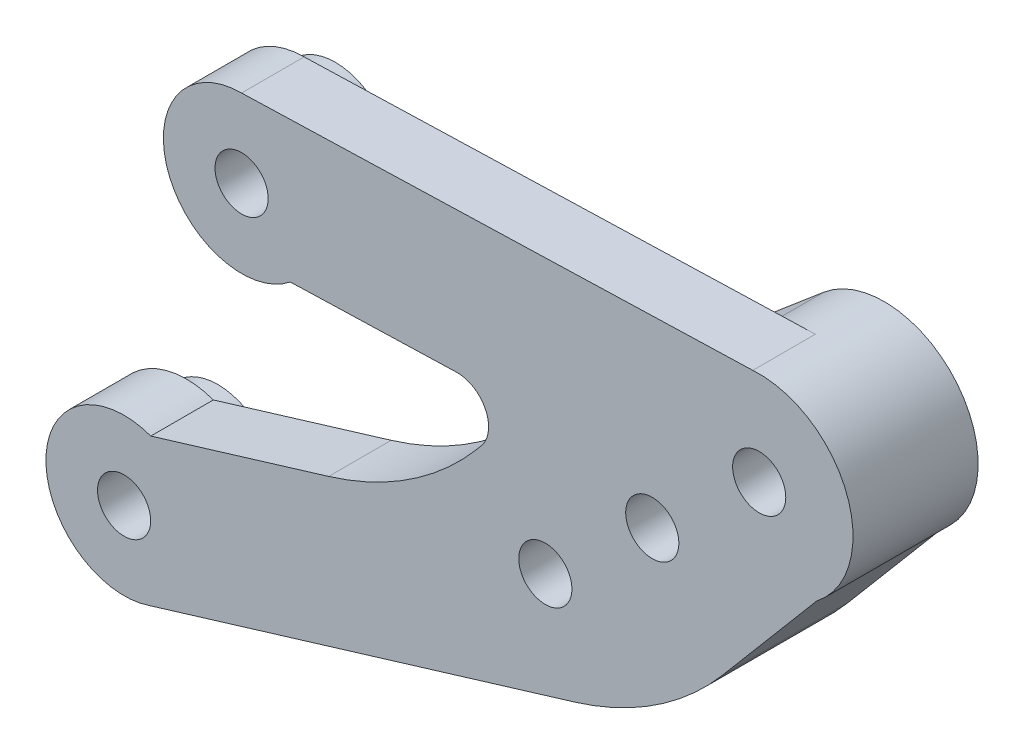
ISO-10303-21;
HEADER;
FILE_DESCRIPTION(('STEP AP214'),'2;1');
FILE_NAME('part.step','',(''),(''),'','','');
FILE_SCHEMA(('AUTOMOTIVE_DESIGN { 1 0 10303 214 1 1 1 1 }'));
ENDSEC;
DATA;
#1=APPLICATION_CONTEXT('core data for automotive mechanical design processes');
#2=APPLICATION_PROTOCOL_DEFINITION('international standard','automotive_design',2000,#1);
#3=PRODUCT_CONTEXT('',#1,'mechanical');
#4=PRODUCT('Part','Part','',(#3));
#5=PRODUCT_RELATED_PRODUCT_CATEGORY('part','',(#4));
#6=PRODUCT_DEFINITION_FORMATION('','',#4);
#7=PRODUCT_DEFINITION_CONTEXT('part definition',#1,'design');
#8=PRODUCT_DEFINITION('design','',#6,#7);
#9=PRODUCT_DEFINITION_SHAPE('','',#8);
#10=(LENGTH_UNIT() NAMED_UNIT(*) SI_UNIT(.MILLI.,.METRE.));
#11=(NAMED_UNIT(*) PLANE_ANGLE_UNIT() SI_UNIT($,.RADIAN.));
#12=(NAMED_UNIT(*) SI_UNIT($,.STERADIAN.) SOLID_ANGLE_UNIT());
#13=UNCERTAINTY_MEASURE_WITH_UNIT(LENGTH_MEASURE(1.E-05),#10,'distance_accuracy_value','');
#14=(GEOMETRIC_REPRESENTATION_CONTEXT(3) GLOBAL_UNCERTAINTY_ASSIGNED_CONTEXT((#13)) GLOBAL_UNIT_ASSIGNED_CONTEXT((#10,
#11,#12)) REPRESENTATION_CONTEXT('',''));
#15=CARTESIAN_POINT('',(0.,0.,0.));
#16=DIRECTION('',(0.,0.,1.));
#17=DIRECTION('',(1.,0.,0.));
#18=AXIS2_PLACEMENT_3D('',#15,#16,#17);
#19=CARTESIAN_POINT('',(0.,0.,-2.));
#20=DIRECTION('',(0.,0.,1.));
#21=DIRECTION('',(1.,0.,0.));
#22=AXIS2_PLACEMENT_3D('',#19,#20,#21);
#23=PLANE('',#22);
#24=CARTESIAN_POINT('',(26.9360632309097,9.68603359319531,-2.));
#25=DIRECTION('',(0.,0.,-1.));
#26=DIRECTION('',(-1.,0.,0.));
#27=AXIS2_PLACEMENT_3D('',#24,#25,#26);
#28=CIRCLE('',#27,6.44539896497374);
#29=CARTESIAN_POINT('',(28.8076552815149,3.5183508019198,-2.));
#30=VERTEX_POINT('',#29);
#31=CARTESIAN_POINT('',(21.6839891931415,13.4221928670333,-2.));
#32=VERTEX_POINT('',#31);
#33=EDGE_CURVE('E179',#30,#32,#28,.T.);
#34=ORIENTED_EDGE('',*,*,#33,.F.);
#35=DIRECTION('',(0.956912492894943,0.290376446947038,0.));
#36=VECTOR('',#35,1.);
#37=CARTESIAN_POINT('',(1.45139171596717,-4.78294599887616,-2.));
#38=LINE('',#37,#36);
#39=CARTESIAN_POINT('',(1.57575227360064,-4.74520861208887,-2.));
#40=VERTEX_POINT('',#39);
#41=EDGE_CURVE('E273',#40,#30,#38,.T.);
#42=ORIENTED_EDGE('',*,*,#41,.F.);
#43=CARTESIAN_POINT('',(0.,0.,-2.));
#44=DIRECTION('',(0.,0.,1.));
#45=DIRECTION('',(1.,0.,0.));
#46=AXIS2_PLACEMENT_3D('',#43,#44,#45);
#47=CIRCLE('',#46,5.);
#48=CARTESIAN_POINT('',(1.70658461953951,4.69974136909162,-2.));
#49=VERTEX_POINT('',#48);
#50=EDGE_CURVE('E269',#49,#40,#47,.T.);
#51=ORIENTED_EDGE('',*,*,#50,.F.);
#52=DIRECTION('',(-0.956912492894943,-0.290376446947038,0.));
#53=VECTOR('',#52,1.);
#54=CARTESIAN_POINT('',(-1.16199630655618,3.82926643717832,-2.));
#55=LINE('',#54,#53);
#56=CARTESIAN_POINT('',(13.0793967045248,8.15083725252361,-2.));
#57=VERTEX_POINT('',#56);
#58=EDGE_CURVE('E266',#57,#49,#55,.T.);
#59=ORIENTED_EDGE('',*,*,#58,.F.);
#60=CARTESIAN_POINT('',(7.27186776558407,27.2890871104225,-2.));
#61=DIRECTION('',(0.,0.,1.));
#62=DIRECTION('',(1.,0.,0.));
#63=AXIS2_PLACEMENT_3D('',#60,#61,#62);
#64=CIRCLE('',#63,20.);
#65=EDGE_CURVE('E311',#57,#32,#64,.T.);
#66=ORIENTED_EDGE('',*,*,#65,.T.);
#67=EDGE_LOOP('',(#34,#42,#51,#59,#66));
#68=FACE_BOUND('',#67,.T.);
#69=CARTESIAN_POINT('',(0.,0.,-2.));
#70=DIRECTION('',(0.,0.,1.));
#71=DIRECTION('',(1.,0.,0.));
#72=AXIS2_PLACEMENT_3D('',#69,#70,#71);
#73=CIRCLE('',#72,3.7);
#74=CARTESIAN_POINT('',(3.7,0.,-2.));
#75=VERTEX_POINT('',#74);
#76=EDGE_CURVE('E318',#75,#75,#73,.F.);
#77=ORIENTED_EDGE('',*,*,#76,.F.);
#78=EDGE_LOOP('',(#77));
#79=FACE_BOUND('',#78,.T.);
#80=ADVANCED_FACE('F41',(#68,#79),#23,.F.);
#81=CARTESIAN_POINT('',(40.6128867069486,21.6007739057783,-2.));
#82=DIRECTION('',(0.,0.,-1.));
#83=DIRECTION('',(-1.,0.,0.));
#84=AXIS2_PLACEMENT_3D('',#81,#82,#83);
#85=CIRCLE('',#84,6.);
#86=CARTESIAN_POINT('',(36.7334177781984,26.1778604060383,-2.));
#87=VERTEX_POINT('',#86);
#88=CARTESIAN_POINT('',(40.203783053973,27.5868105078317,-2.));
#89=VERTEX_POINT('',#88);
#90=EDGE_CURVE('E193',#87,#89,#85,.T.);
#91=ORIENTED_EDGE('',*,*,#90,.F.);
#92=DIRECTION('',(0.762847733091093,0.646578174792329,0.));
#93=VECTOR('',#92,1.);
#94=CARTESIAN_POINT('',(36.7334177781984,26.1778604060383,-2.));
#95=LINE('',#94,#93);
#96=EDGE_CURVE('E175',#32,#87,#95,.T.);
#97=ORIENTED_EDGE('',*,*,#96,.F.);
#98=CARTESIAN_POINT('',(22.5414357724455,14.3724198590053,-2.));
#99=VERTEX_POINT('',#98);
#100=EDGE_CURVE('E310',#32,#99,#64,.T.);
#101=ORIENTED_EDGE('',*,*,#100,.T.);
#102=DIRECTION('',(-0.645833362570859,-0.763478400343073,0.));
#103=VECTOR('',#102,1.);
#104=CARTESIAN_POINT('',(6.0526361731001,-5.11998030374497,-2.));
#105=LINE('',#104,#103);
#106=CARTESIAN_POINT('',(22.8356424846143,14.7202192806435,-2.));
#107=VERTEX_POINT('',#106);
#108=EDGE_CURVE('E263',#107,#99,#105,.T.);
#109=ORIENTED_EDGE('',*,*,#108,.F.);
#110=CARTESIAN_POINT('',(21.3086856839282,16.0118860057853,-2.));
#111=DIRECTION('',(0.,0.,1.));
#112=DIRECTION('',(1.,0.,0.));
#113=AXIS2_PLACEMENT_3D('',#110,#111,#112);
#114=CIRCLE('',#113,2.);
#115=CARTESIAN_POINT('',(21.248388262694,18.0109768543943,-2.));
#116=VERTEX_POINT('',#115);
#117=EDGE_CURVE('E11',#107,#116,#114,.T.);
#118=ORIENTED_EDGE('',*,*,#117,.T.);
#119=DIRECTION('',(0.999545424304533,0.0301487106170736,0.));
#120=VECTOR('',#119,1.);
#121=CARTESIAN_POINT('',(-0.523447280000722,17.3542855691174,-2.));
#122=LINE('',#121,#120);
#123=CARTESIAN_POINT('',(10.6291548266564,17.6906750571438,-2.));
#124=VERTEX_POINT('',#123);
#125=EDGE_CURVE('E259',#124,#116,#122,.T.);
#126=ORIENTED_EDGE('',*,*,#125,.F.);
#127=CARTESIAN_POINT('',(7.51288670694863,21.6007739057783,-2.));
#128=DIRECTION('',(0.,0.,1.));
#129=DIRECTION('',(1.,0.,0.));
#130=AXIS2_PLACEMENT_3D('',#127,#128,#129);
#131=CIRCLE('',#130,5.);
#132=CARTESIAN_POINT('',(7.51288670694863,26.6007739057783,-2.));
#133=VERTEX_POINT('',#132);
#134=EDGE_CURVE('E255',#133,#124,#131,.T.);
#135=ORIENTED_EDGE('',*,*,#134,.F.);
#136=DIRECTION('',(0.999545424304533,0.0301487106170735,0.));
#137=VECTOR('',#136,1.);
#138=CARTESIAN_POINT('',(-0.794785675554382,26.3501943878582,-2.));
#139=LINE('',#138,#137);
#140=EDGE_CURVE('E252',#133,#89,#139,.T.);
#141=ORIENTED_EDGE('',*,*,#140,.T.);
#142=EDGE_LOOP('',(#91,#97,#101,#109,#118,#126,#135,#141));
#143=FACE_BOUND('',#142,.T.);
#144=CARTESIAN_POINT('',(7.51288670694863,21.6007739057783,-2.));
#145=DIRECTION('',(0.,0.,1.));
#146=DIRECTION('',(1.,0.,0.));
#147=AXIS2_PLACEMENT_3D('',#144,#145,#146);
#148=CIRCLE('',#147,3.7);
#149=CARTESIAN_POINT('',(11.2128867069486,21.6007739057783,-2.));
#150=VERTEX_POINT('',#149);
#151=EDGE_CURVE('E314',#150,#150,#148,.F.);
#152=ORIENTED_EDGE('',*,*,#151,.F.);
#153=EDGE_LOOP('',(#152));
#154=FACE_BOUND('',#153,.T.);
#155=ADVANCED_FACE('F334',(#143,#154),#23,.F.);
#156=CARTESIAN_POINT('',(-0.794785675554382,26.3501943878582,-2.));
#157=DIRECTION('',(0.0301487106170735,-0.999545424304533,0.));
#158=DIRECTION('',(0.999545424304533,0.0301487106170735,0.));
#159=AXIS2_PLACEMENT_3D('',#156,#157,#158);
#160=PLANE('',#159);
#161=DIRECTION('',(0.,0.,1.));
#162=VECTOR('',#161,1.);
#163=CARTESIAN_POINT('',(7.51288670694863,26.6007739057783,-2.));
#164=LINE('',#163,#162);
#165=CARTESIAN_POINT('',(7.51288670694863,26.6007739057783,2.));
#166=VERTEX_POINT('',#165);
#167=EDGE_CURVE('E277',#133,#166,#164,.T.);
#168=ORIENTED_EDGE('',*,*,#167,.T.);
#169=DIRECTION('',(0.999545424304533,0.0301487106170735,0.));
#170=VECTOR('',#169,1.);
#171=CARTESIAN_POINT('',(-0.794785675554382,26.3501943878582,2.));
#172=LINE('',#171,#170);
#173=CARTESIAN_POINT('',(40.203783053973,27.5868105078317,2.));
#174=VERTEX_POINT('',#173);
#175=EDGE_CURVE('E222',#166,#174,#172,.T.);
#176=ORIENTED_EDGE('',*,*,#175,.T.);
#177=DIRECTION('',(0.,0.,1.));
#178=VECTOR('',#177,1.);
#179=CARTESIAN_POINT('',(40.203783053973,27.5868105078317,-2.));
#180=LINE('',#179,#178);
#181=EDGE_CURVE('E156',#89,#174,#180,.T.);
#182=ORIENTED_EDGE('',*,*,#181,.F.);
#183=ORIENTED_EDGE('',*,*,#140,.F.);
#184=EDGE_LOOP('',(#168,#176,#182,#183));
#185=FACE_BOUND('',#184,.T.);
#186=ADVANCED_FACE('F357',(#185),#160,.F.);
#187=CARTESIAN_POINT('',(40.6128867069486,21.6007739057783,-2.));
#188=DIRECTION('',(0.,0.,1.));
#189=DIRECTION('',(1.,0.,0.));
#190=AXIS2_PLACEMENT_3D('',#187,#188,#189);
#191=CYLINDRICAL_SURFACE('',#190,6.);
#192=ORIENTED_EDGE('',*,*,#181,.T.);
#193=CARTESIAN_POINT('',(40.6128867069486,21.6007739057783,2.));
#194=DIRECTION('',(0.,0.,1.));
#195=DIRECTION('',(1.,0.,0.));
#196=AXIS2_PLACEMENT_3D('',#193,#194,#195);
#197=CIRCLE('',#196,6.);
#198=CARTESIAN_POINT('',(44.2966352413055,16.8647421559245,2.));
#199=VERTEX_POINT('',#198);
#200=EDGE_CURVE('E152',#199,#174,#197,.T.);
#201=ORIENTED_EDGE('',*,*,#200,.F.);
#202=DIRECTION('',(0.,0.,1.));
#203=VECTOR('',#202,1.);
#204=CARTESIAN_POINT('',(44.2966352413055,16.8647421559245,-2.));
#205=LINE('',#204,#203);
#206=CARTESIAN_POINT('',(44.2966352413055,16.8647421559245,-6.));
#207=VERTEX_POINT('',#206);
#208=EDGE_CURVE('E145',#207,#199,#205,.T.);
#209=ORIENTED_EDGE('',*,*,#208,.F.);
#210=CARTESIAN_POINT('',(40.6128867069486,21.6007739057783,-6.));
#211=DIRECTION('',(0.,0.,-1.));
#212=DIRECTION('',(-1.,0.,0.));
#213=AXIS2_PLACEMENT_3D('',#210,#211,#212);
#214=CIRCLE('',#213,6.);
#215=CARTESIAN_POINT('',(36.7334177781984,26.1778604060383,-6.));
#216=VERTEX_POINT('',#215);
#217=EDGE_CURVE('E150',#216,#207,#214,.T.);
#218=ORIENTED_EDGE('',*,*,#217,.F.);
#219=DIRECTION('',(0.,0.,1.));
#220=VECTOR('',#219,1.);
#221=CARTESIAN_POINT('',(36.7334177781984,26.1778604060383,-6.));
#222=LINE('',#221,#220);
#223=EDGE_CURVE('E192',#216,#87,#222,.T.);
#224=ORIENTED_EDGE('',*,*,#223,.T.);
#225=ORIENTED_EDGE('',*,*,#90,.T.);
#226=EDGE_LOOP('',(#192,#201,#209,#218,#224,#225));
#227=FACE_BOUND('',#226,.T.);
#228=ADVANCED_FACE('F147',(#227),#191,.T.);
#229=CARTESIAN_POINT('',(17.5048121782462,-14.8074807423079,-2.));
#230=DIRECTION('',(0.763478400343073,-0.645833362570859,0.));
#231=DIRECTION('',(0.645833362570859,0.763478400343073,0.));
#232=AXIS2_PLACEMENT_3D('',#229,#230,#231);
#233=PLANE('',#232);
#234=DIRECTION('',(0.645833362570859,0.763478400343073,0.));
#235=VECTOR('',#234,1.);
#236=CARTESIAN_POINT('',(17.5048121782462,-14.8074807423079,2.));
#237=LINE('',#236,#235);
#238=CARTESIAN_POINT('',(38.2696943494356,9.7399334084015,2.));
#239=VERTEX_POINT('',#238);
#240=EDGE_CURVE('E247',#239,#199,#237,.T.);
#241=ORIENTED_EDGE('',*,*,#240,.F.);
#242=DIRECTION('',(0.,0.,1.));
#243=VECTOR('',#242,1.);
#244=CARTESIAN_POINT('',(38.2696943494356,9.73993340840149,-2.));
#245=LINE('',#244,#243);
#246=CARTESIAN_POINT('',(38.2696943494356,9.7399334084015,-6.));
#247=VERTEX_POINT('',#246);
#248=EDGE_CURVE('E163',#239,#247,#245,.F.);
#249=ORIENTED_EDGE('',*,*,#248,.T.);
#250=DIRECTION('',(-0.645833362570859,-0.763478400343073,0.));
#251=VECTOR('',#250,1.);
#252=CARTESIAN_POINT('',(44.2966352413055,16.8647421559245,-6.));
#253=LINE('',#252,#251);
#254=EDGE_CURVE('E160',#207,#247,#253,.T.);
#255=ORIENTED_EDGE('',*,*,#254,.F.);
#256=ORIENTED_EDGE('',*,*,#208,.T.);
#257=EDGE_LOOP('',(#241,#249,#255,#256));
#258=FACE_BOUND('',#257,.T.);
#259=ADVANCED_FACE('F161',(#258),#233,.T.);
#260=CARTESIAN_POINT('',(1.45139171596717,-4.78294599887616,-2.));
#261=DIRECTION('',(0.290376446947038,-0.956912492894943,0.));
#262=DIRECTION('',(0.956912492894943,0.290376446947038,0.));
#263=AXIS2_PLACEMENT_3D('',#260,#261,#262);
#264=PLANE('',#263);
#265=ORIENTED_EDGE('',*,*,#41,.T.);
#266=DIRECTION('',(0.,0.,1.));
#267=VECTOR('',#266,1.);
#268=CARTESIAN_POINT('',(28.8076552815149,3.5183508019198,-2.));
#269=LINE('',#268,#267);
#270=CARTESIAN_POINT('',(28.8076552815149,3.5183508019198,2.));
#271=VERTEX_POINT('',#270);
#272=EDGE_CURVE('E298',#30,#271,#269,.T.);
#273=ORIENTED_EDGE('',*,*,#272,.T.);
#274=DIRECTION('',(0.956912492894943,0.290376446947038,0.));
#275=VECTOR('',#274,1.);
#276=CARTESIAN_POINT('',(1.45139171596717,-4.78294599887616,2.));
#277=LINE('',#276,#275);
#278=CARTESIAN_POINT('',(1.57575227360064,-4.74520861208887,2.));
#279=VERTEX_POINT('',#278);
#280=EDGE_CURVE('E243',#279,#271,#277,.T.);
#281=ORIENTED_EDGE('',*,*,#280,.F.);
#282=DIRECTION('',(0.,0.,1.));
#283=VECTOR('',#282,1.);
#284=CARTESIAN_POINT('',(1.57575227360064,-4.74520861208887,-2.));
#285=LINE('',#284,#283);
#286=EDGE_CURVE('E157',#40,#279,#285,.T.);
#287=ORIENTED_EDGE('',*,*,#286,.F.);
#288=EDGE_LOOP('',(#265,#273,#281,#287));
#289=FACE_BOUND('',#288,.T.);
#290=ADVANCED_FACE('F372',(#289),#264,.T.);
#291=CARTESIAN_POINT('',(0.,0.,-2.));
#292=DIRECTION('',(0.,0.,1.));
#293=DIRECTION('',(1.,0.,0.));
#294=AXIS2_PLACEMENT_3D('',#291,#292,#293);
#295=CYLINDRICAL_SURFACE('',#294,5.);
#296=ORIENTED_EDGE('',*,*,#286,.T.);
#297=CARTESIAN_POINT('',(0.,0.,2.));
#298=DIRECTION('',(0.,0.,1.));
#299=DIRECTION('',(1.,0.,0.));
#300=AXIS2_PLACEMENT_3D('',#297,#298,#299);
#301=CIRCLE('',#300,5.);
#302=CARTESIAN_POINT('',(1.70658461953951,4.69974136909162,2.));
#303=VERTEX_POINT('',#302);
#304=EDGE_CURVE('E239',#303,#279,#301,.T.);
#305=ORIENTED_EDGE('',*,*,#304,.F.);
#306=DIRECTION('',(0.,0.,1.));
#307=VECTOR('',#306,1.);
#308=CARTESIAN_POINT('',(1.70658461953951,4.69974136909162,-2.));
#309=LINE('',#308,#307);
#310=EDGE_CURVE('E283',#49,#303,#309,.T.);
#311=ORIENTED_EDGE('',*,*,#310,.F.);
#312=ORIENTED_EDGE('',*,*,#50,.T.);
#313=EDGE_LOOP('',(#296,#305,#311,#312));
#314=FACE_BOUND('',#313,.T.);
#315=ADVANCED_FACE('F381',(#314),#295,.T.);
#316=CARTESIAN_POINT('',(-1.16199630655618,3.82926643717832,-2.));
#317=DIRECTION('',(-0.290376446947038,0.956912492894943,0.));
#318=DIRECTION('',(-0.956912492894943,-0.290376446947038,0.));
#319=AXIS2_PLACEMENT_3D('',#316,#317,#318);
#320=PLANE('',#319);
#321=DIRECTION('',(-0.956912492894943,-0.290376446947038,0.));
#322=VECTOR('',#321,1.);
#323=CARTESIAN_POINT('',(-1.16199630655618,3.82926643717832,2.));
#324=LINE('',#323,#322);
#325=CARTESIAN_POINT('',(13.0793967045248,8.15083725252361,2.));
#326=VERTEX_POINT('',#325);
#327=EDGE_CURVE('E236',#326,#303,#324,.T.);
#328=ORIENTED_EDGE('',*,*,#327,.F.);
#329=DIRECTION('',(0.,0.,1.));
#330=VECTOR('',#329,1.);
#331=CARTESIAN_POINT('',(13.0793967045248,8.15083725252361,-2.));
#332=LINE('',#331,#330);
#333=EDGE_CURVE('E295',#326,#57,#332,.F.);
#334=ORIENTED_EDGE('',*,*,#333,.T.);
#335=ORIENTED_EDGE('',*,*,#58,.T.);
#336=ORIENTED_EDGE('',*,*,#310,.T.);
#337=EDGE_LOOP('',(#328,#334,#335,#336));
#338=FACE_BOUND('',#337,.T.);
#339=ADVANCED_FACE('F383',(#338),#320,.T.);
#340=CARTESIAN_POINT('',(6.0526361731001,-5.11998030374497,-2.));
#341=DIRECTION('',(-0.763478400343073,0.645833362570859,0.));
#342=DIRECTION('',(-0.645833362570859,-0.763478400343073,0.));
#343=AXIS2_PLACEMENT_3D('',#340,#341,#342);
#344=PLANE('',#343);
#345=DIRECTION('',(-0.645833362570859,-0.763478400343073,0.));
#346=VECTOR('',#345,1.);
#347=CARTESIAN_POINT('',(6.0526361731001,-5.11998030374497,2.));
#348=LINE('',#347,#346);
#349=CARTESIAN_POINT('',(22.8356424846143,14.7202192806435,2.));
#350=VERTEX_POINT('',#349);
#351=CARTESIAN_POINT('',(22.5414357724455,14.3724198590053,2.));
#352=VERTEX_POINT('',#351);
#353=EDGE_CURVE('E233',#350,#352,#348,.T.);
#354=ORIENTED_EDGE('',*,*,#353,.F.);
#355=DIRECTION('',(0.,0.,1.));
#356=VECTOR('',#355,1.);
#357=CARTESIAN_POINT('',(22.8356424846143,14.7202192806435,-2.));
#358=LINE('',#357,#356);
#359=EDGE_CURVE('E63',#350,#107,#358,.F.);
#360=ORIENTED_EDGE('',*,*,#359,.T.);
#361=ORIENTED_EDGE('',*,*,#108,.T.);
#362=DIRECTION('',(0.,0.,1.));
#363=VECTOR('',#362,1.);
#364=CARTESIAN_POINT('',(22.5414357724455,14.3724198590053,2.));
#365=LINE('',#364,#363);
#366=EDGE_CURVE('E279',#99,#352,#365,.T.);
#367=ORIENTED_EDGE('',*,*,#366,.T.);
#368=EDGE_LOOP('',(#354,#360,#361,#367));
#369=FACE_BOUND('',#368,.T.);
#370=ADVANCED_FACE('F342',(#369),#344,.T.);
#371=CARTESIAN_POINT('',(-0.523447280000722,17.3542855691174,-2.));
#372=DIRECTION('',(0.0301487106170736,-0.999545424304533,0.));
#373=DIRECTION('',(0.999545424304533,0.0301487106170736,0.));
#374=AXIS2_PLACEMENT_3D('',#371,#372,#373);
#375=PLANE('',#374);
#376=ORIENTED_EDGE('',*,*,#125,.T.);
#377=DIRECTION('',(0.,0.,1.));
#378=VECTOR('',#377,1.);
#379=CARTESIAN_POINT('',(21.248388262694,18.0109768543943,2.));
#380=LINE('',#379,#378);
#381=CARTESIAN_POINT('',(21.248388262694,18.0109768543943,2.));
#382=VERTEX_POINT('',#381);
#383=EDGE_CURVE('E322',#116,#382,#380,.T.);
#384=ORIENTED_EDGE('',*,*,#383,.T.);
#385=DIRECTION('',(0.999545424304533,0.0301487106170736,0.));
#386=VECTOR('',#385,1.);
#387=CARTESIAN_POINT('',(-0.523447280000722,17.3542855691174,2.));
#388=LINE('',#387,#386);
#389=CARTESIAN_POINT('',(10.6291548266564,17.6906750571438,2.));
#390=VERTEX_POINT('',#389);
#391=EDGE_CURVE('E230',#390,#382,#388,.T.);
#392=ORIENTED_EDGE('',*,*,#391,.F.);
#393=DIRECTION('',(0.,0.,1.));
#394=VECTOR('',#393,1.);
#395=CARTESIAN_POINT('',(10.6291548266564,17.6906750571438,-2.));
#396=LINE('',#395,#394);
#397=EDGE_CURVE('E287',#124,#390,#396,.T.);
#398=ORIENTED_EDGE('',*,*,#397,.F.);
#399=EDGE_LOOP('',(#376,#384,#392,#398));
#400=FACE_BOUND('',#399,.T.);
#401=ADVANCED_FACE('F348',(#400),#375,.T.);
#402=CARTESIAN_POINT('',(7.51288670694863,21.6007739057783,-2.));
#403=DIRECTION('',(0.,0.,1.));
#404=DIRECTION('',(1.,0.,0.));
#405=AXIS2_PLACEMENT_3D('',#402,#403,#404);
#406=CYLINDRICAL_SURFACE('',#405,1.7);
#407=CARTESIAN_POINT('',(7.51288670694863,21.6007739057783,2.));
#408=DIRECTION('',(0.,0.,1.));
#409=DIRECTION('',(1.,0.,0.));
#410=AXIS2_PLACEMENT_3D('',#407,#408,#409);
#411=CIRCLE('',#410,1.7);
#412=CARTESIAN_POINT('',(9.21288670694863,21.6007739057783,2.));
#413=VERTEX_POINT('',#412);
#414=EDGE_CURVE('E218',#413,#413,#411,.T.);
#415=ORIENTED_EDGE('',*,*,#414,.T.);
#416=EDGE_LOOP('',(#415));
#417=FACE_BOUND('',#416,.T.);
#418=CARTESIAN_POINT('',(7.51288670694863,21.6007739057783,-4.));
#419=DIRECTION('',(0.,0.,-1.));
#420=DIRECTION('',(-1.,0.,0.));
#421=AXIS2_PLACEMENT_3D('',#418,#419,#420);
#422=CIRCLE('',#421,1.7);
#423=CARTESIAN_POINT('',(5.81288670694863,21.6007739057783,-4.));
#424=VERTEX_POINT('',#423);
#425=EDGE_CURVE('E633',#424,#424,#422,.T.);
#426=ORIENTED_EDGE('',*,*,#425,.T.);
#427=EDGE_LOOP('',(#426));
#428=FACE_BOUND('',#427,.T.);
#429=ADVANCED_FACE('F466',(#417,#428),#406,.F.);
#430=CARTESIAN_POINT('',(40.6128867069486,21.6007739057783,-2.));
#431=DIRECTION('',(0.,0.,1.));
#432=DIRECTION('',(1.,0.,0.));
#433=AXIS2_PLACEMENT_3D('',#430,#431,#432);
#434=CYLINDRICAL_SURFACE('',#433,1.7);
#435=CARTESIAN_POINT('',(40.6128867069486,21.6007739057783,2.));
#436=DIRECTION('',(0.,0.,1.));
#437=DIRECTION('',(1.,0.,0.));
#438=AXIS2_PLACEMENT_3D('',#435,#436,#437);
#439=CIRCLE('',#438,1.7);
#440=CARTESIAN_POINT('',(42.3128867069486,21.6007739057783,2.));
#441=VERTEX_POINT('',#440);
#442=EDGE_CURVE('E214',#441,#441,#439,.T.);
#443=ORIENTED_EDGE('',*,*,#442,.T.);
#444=EDGE_LOOP('',(#443));
#445=FACE_BOUND('',#444,.T.);
#446=CARTESIAN_POINT('',(40.6128867069486,21.6007739057783,-6.));
#447=DIRECTION('',(0.,0.,-1.));
#448=DIRECTION('',(-1.,0.,0.));
#449=AXIS2_PLACEMENT_3D('',#446,#447,#448);
#450=CIRCLE('',#449,1.7);
#451=CARTESIAN_POINT('',(38.9128867069486,21.6007739057783,-6.));
#452=VERTEX_POINT('',#451);
#453=EDGE_CURVE('E182',#452,#452,#450,.T.);
#454=ORIENTED_EDGE('',*,*,#453,.T.);
#455=EDGE_LOOP('',(#454));
#456=FACE_BOUND('',#455,.T.);
#457=ADVANCED_FACE('F460',(#445,#456),#434,.F.);
#458=CARTESIAN_POINT('',(0.,0.,-2.));
#459=DIRECTION('',(0.,0.,1.));
#460=DIRECTION('',(1.,0.,0.));
#461=AXIS2_PLACEMENT_3D('',#458,#459,#460);
#462=CYLINDRICAL_SURFACE('',#461,1.7);
#463=CARTESIAN_POINT('',(0.,0.,2.));
#464=DIRECTION('',(0.,0.,1.));
#465=DIRECTION('',(1.,0.,0.));
#466=AXIS2_PLACEMENT_3D('',#463,#464,#465);
#467=CIRCLE('',#466,1.7);
#468=CARTESIAN_POINT('',(1.7,0.,2.));
#469=VERTEX_POINT('',#468);
#470=EDGE_CURVE('E210',#469,#469,#467,.T.);
#471=ORIENTED_EDGE('',*,*,#470,.T.);
#472=EDGE_LOOP('',(#471));
#473=FACE_BOUND('',#472,.T.);
#474=CARTESIAN_POINT('',(0.,0.,-4.));
#475=DIRECTION('',(0.,0.,-1.));
#476=DIRECTION('',(-1.,0.,0.));
#477=AXIS2_PLACEMENT_3D('',#474,#475,#476);
#478=CIRCLE('',#477,1.7);
#479=CARTESIAN_POINT('',(-1.7,0.,-4.));
#480=VERTEX_POINT('',#479);
#481=EDGE_CURVE('E643',#480,#480,#478,.T.);
#482=ORIENTED_EDGE('',*,*,#481,.T.);
#483=EDGE_LOOP('',(#482));
#484=FACE_BOUND('',#483,.T.);
#485=ADVANCED_FACE('F423',(#473,#484),#462,.F.);
#486=CARTESIAN_POINT('',(7.51288670694863,21.6007739057783,-2.));
#487=DIRECTION('',(0.,0.,1.));
#488=DIRECTION('',(1.,0.,0.));
#489=AXIS2_PLACEMENT_3D('',#486,#487,#488);
#490=CYLINDRICAL_SURFACE('',#489,5.);
#491=ORIENTED_EDGE('',*,*,#397,.T.);
#492=CARTESIAN_POINT('',(7.51288670694863,21.6007739057783,2.));
#493=DIRECTION('',(0.,0.,1.));
#494=DIRECTION('',(1.,0.,0.));
#495=AXIS2_PLACEMENT_3D('',#492,#493,#494);
#496=CIRCLE('',#495,5.);
#497=EDGE_CURVE('E226',#166,#390,#496,.T.);
#498=ORIENTED_EDGE('',*,*,#497,.F.);
#499=ORIENTED_EDGE('',*,*,#167,.F.);
#500=ORIENTED_EDGE('',*,*,#134,.T.);
#501=EDGE_LOOP('',(#491,#498,#499,#500));
#502=FACE_BOUND('',#501,.T.);
#503=ADVANCED_FACE('F352',(#502),#490,.T.);
#504=CARTESIAN_POINT('',(0.,0.,2.));
#505=DIRECTION('',(0.,0.,1.));
#506=DIRECTION('',(1.,0.,0.));
#507=AXIS2_PLACEMENT_3D('',#504,#505,#506);
#508=PLANE('',#507);
#509=CARTESIAN_POINT('',(33.7740274653888,15.643013901034,2.));
#510=DIRECTION('',(0.,0.,-1.));
#511=DIRECTION('',(-1.,0.,0.));
#512=AXIS2_PLACEMENT_3D('',#509,#510,#511);
#513=CIRCLE('',#512,1.7);
#514=CARTESIAN_POINT('',(32.0740274653888,15.643013901034,2.));
#515=VERTEX_POINT('',#514);
#516=EDGE_CURVE('E620',#515,#515,#513,.T.);
#517=ORIENTED_EDGE('',*,*,#516,.T.);
#518=EDGE_LOOP('',(#517));
#519=FACE_BOUND('',#518,.T.);
#520=CARTESIAN_POINT('',(26.9360632309097,9.68603359319531,2.));
#521=DIRECTION('',(0.,0.,-1.));
#522=DIRECTION('',(-1.,0.,0.));
#523=AXIS2_PLACEMENT_3D('',#520,#521,#522);
#524=CIRCLE('',#523,1.7);
#525=CARTESIAN_POINT('',(25.2360632309097,9.68603359319531,2.));
#526=VERTEX_POINT('',#525);
#527=EDGE_CURVE('E624',#526,#526,#524,.T.);
#528=ORIENTED_EDGE('',*,*,#527,.T.);
#529=EDGE_LOOP('',(#528));
#530=FACE_BOUND('',#529,.T.);
#531=ORIENTED_EDGE('',*,*,#470,.F.);
#532=EDGE_LOOP('',(#531));
#533=FACE_BOUND('',#532,.T.);
#534=ORIENTED_EDGE('',*,*,#442,.F.);
#535=EDGE_LOOP('',(#534));
#536=FACE_BOUND('',#535,.T.);
#537=ORIENTED_EDGE('',*,*,#414,.F.);
#538=EDGE_LOOP('',(#537));
#539=FACE_BOUND('',#538,.T.);
#540=ORIENTED_EDGE('',*,*,#280,.T.);
#541=CARTESIAN_POINT('',(23.0001263425741,22.6566006598187,2.));
#542=DIRECTION('',(0.,0.,1.));
#543=DIRECTION('',(1.,0.,0.));
#544=AXIS2_PLACEMENT_3D('',#541,#542,#543);
#545=CIRCLE('',#544,20.);
#546=EDGE_CURVE('E302',#271,#239,#545,.T.);
#547=ORIENTED_EDGE('',*,*,#546,.T.);
#548=ORIENTED_EDGE('',*,*,#240,.T.);
#549=ORIENTED_EDGE('',*,*,#200,.T.);
#550=ORIENTED_EDGE('',*,*,#175,.F.);
#551=ORIENTED_EDGE('',*,*,#497,.T.);
#552=ORIENTED_EDGE('',*,*,#391,.T.);
#553=CARTESIAN_POINT('',(21.3086856839282,16.0118860057853,2.));
#554=DIRECTION('',(0.,0.,1.));
#555=DIRECTION('',(1.,0.,0.));
#556=AXIS2_PLACEMENT_3D('',#553,#554,#555);
#557=CIRCLE('',#556,2.);
#558=EDGE_CURVE('E50',#382,#350,#557,.F.);
#559=ORIENTED_EDGE('',*,*,#558,.T.);
#560=ORIENTED_EDGE('',*,*,#353,.T.);
#561=CARTESIAN_POINT('',(7.27186776558407,27.2890871104225,2.));
#562=DIRECTION('',(0.,0.,1.));
#563=DIRECTION('',(1.,0.,0.));
#564=AXIS2_PLACEMENT_3D('',#561,#562,#563);
#565=CIRCLE('',#564,20.);
#566=EDGE_CURVE('E307',#352,#326,#565,.F.);
#567=ORIENTED_EDGE('',*,*,#566,.T.);
#568=ORIENTED_EDGE('',*,*,#327,.T.);
#569=ORIENTED_EDGE('',*,*,#304,.T.);
#570=EDGE_LOOP('',(#540,#547,#548,#549,#550,#551,#552,#559,#560,#567,#568,#569));
#571=FACE_BOUND('',#570,.T.);
#572=ADVANCED_FACE('F376',(#519,#530,#533,#536,#539,#571),#508,.T.);
#573=CARTESIAN_POINT('',(7.27186776558407,27.2890871104225,-2.));
#574=DIRECTION('',(0.,0.,-1.));
#575=DIRECTION('',(-1.,0.,0.));
#576=AXIS2_PLACEMENT_3D('',#573,#574,#575);
#577=CYLINDRICAL_SURFACE('',#576,20.);
#578=ORIENTED_EDGE('',*,*,#65,.F.);
#579=ORIENTED_EDGE('',*,*,#333,.F.);
#580=ORIENTED_EDGE('',*,*,#566,.F.);
#581=ORIENTED_EDGE('',*,*,#366,.F.);
#582=ORIENTED_EDGE('',*,*,#100,.F.);
#583=EDGE_LOOP('',(#578,#579,#580,#581,#582));
#584=FACE_BOUND('',#583,.T.);
#585=ADVANCED_FACE('F340',(#584),#577,.F.);
#586=CARTESIAN_POINT('',(23.0001263425741,22.6566006598187,-2.));
#587=DIRECTION('',(0.,0.,1.));
#588=DIRECTION('',(1.,0.,0.));
#589=AXIS2_PLACEMENT_3D('',#586,#587,#588);
#590=CYLINDRICAL_SURFACE('',#589,20.);
#591=ORIENTED_EDGE('',*,*,#272,.F.);
#592=DIRECTION('',(0.,0.,1.));
#593=VECTOR('',#592,1.);
#594=CARTESIAN_POINT('',(28.8076552815149,3.5183508019198,-6.));
#595=LINE('',#594,#593);
#596=CARTESIAN_POINT('',(28.8076552815149,3.5183508019198,-6.));
#597=VERTEX_POINT('',#596);
#598=EDGE_CURVE('E206',#597,#30,#595,.T.);
#599=ORIENTED_EDGE('',*,*,#598,.F.);
#600=CARTESIAN_POINT('',(23.0001263425741,22.6566006598188,-6.));
#601=DIRECTION('',(0.,0.,-1.));
#602=DIRECTION('',(-1.,0.,0.));
#603=AXIS2_PLACEMENT_3D('',#600,#601,#602);
#604=CIRCLE('',#603,20.0000000000001);
#605=EDGE_CURVE('E167',#247,#597,#604,.T.);
#606=ORIENTED_EDGE('',*,*,#605,.F.);
#607=ORIENTED_EDGE('',*,*,#248,.F.);
#608=ORIENTED_EDGE('',*,*,#546,.F.);
#609=EDGE_LOOP('',(#591,#599,#606,#607,#608));
#610=FACE_BOUND('',#609,.T.);
#611=ADVANCED_FACE('F375',(#610),#590,.T.);
#612=CARTESIAN_POINT('',(40.6128867069486,21.6007739057783,-6.));
#613=DIRECTION('',(0.,0.,-1.));
#614=DIRECTION('',(-1.,0.,0.));
#615=AXIS2_PLACEMENT_3D('',#612,#613,#614);
#616=PLANE('',#615);
#617=CARTESIAN_POINT('',(33.7740274653888,15.643013901034,-6.));
#618=DIRECTION('',(0.,0.,-1.));
#619=DIRECTION('',(-1.,0.,0.));
#620=AXIS2_PLACEMENT_3D('',#617,#618,#619);
#621=CIRCLE('',#620,1.7);
#622=CARTESIAN_POINT('',(32.0740274653888,15.643013901034,-6.));
#623=VERTEX_POINT('',#622);
#624=EDGE_CURVE('E655',#623,#623,#621,.T.);
#625=ORIENTED_EDGE('',*,*,#624,.F.);
#626=EDGE_LOOP('',(#625));
#627=FACE_BOUND('',#626,.T.);
#628=CARTESIAN_POINT('',(26.9360632309097,9.68603359319531,-6.));
#629=DIRECTION('',(0.,0.,-1.));
#630=DIRECTION('',(-1.,0.,0.));
#631=AXIS2_PLACEMENT_3D('',#628,#629,#630);
#632=CIRCLE('',#631,1.7);
#633=CARTESIAN_POINT('',(25.2360632309097,9.68603359319531,-6.));
#634=VERTEX_POINT('',#633);
#635=EDGE_CURVE('E649',#634,#634,#632,.T.);
#636=ORIENTED_EDGE('',*,*,#635,.F.);
#637=EDGE_LOOP('',(#636));
#638=FACE_BOUND('',#637,.T.);
#639=ORIENTED_EDGE('',*,*,#217,.T.);
#640=ORIENTED_EDGE('',*,*,#254,.T.);
#641=ORIENTED_EDGE('',*,*,#605,.T.);
#642=CARTESIAN_POINT('',(26.9360632309097,9.68603359319531,-6.));
#643=DIRECTION('',(0.,0.,-1.));
#644=DIRECTION('',(-1.,0.,0.));
#645=AXIS2_PLACEMENT_3D('',#642,#643,#644);
#646=CIRCLE('',#645,6.44539896497374);
#647=CARTESIAN_POINT('',(21.6839891931415,13.4221928670333,-6.));
#648=VERTEX_POINT('',#647);
#649=EDGE_CURVE('E187',#597,#648,#646,.T.);
#650=ORIENTED_EDGE('',*,*,#649,.T.);
#651=DIRECTION('',(0.762847733091093,0.646578174792329,0.));
#652=VECTOR('',#651,1.);
#653=CARTESIAN_POINT('',(36.7334177781984,26.1778604060383,-6.));
#654=LINE('',#653,#652);
#655=EDGE_CURVE('E172',#648,#216,#654,.T.);
#656=ORIENTED_EDGE('',*,*,#655,.T.);
#657=EDGE_LOOP('',(#639,#640,#641,#650,#656));
#658=FACE_BOUND('',#657,.T.);
#659=ORIENTED_EDGE('',*,*,#453,.F.);
#660=EDGE_LOOP('',(#659));
#661=FACE_BOUND('',#660,.T.);
#662=ADVANCED_FACE('F169',(#627,#638,#658,#661),#616,.T.);
#663=CARTESIAN_POINT('',(26.9360632309097,9.68603359319531,-6.));
#664=DIRECTION('',(0.,0.,1.));
#665=DIRECTION('',(1.,0.,0.));
#666=AXIS2_PLACEMENT_3D('',#663,#664,#665);
#667=CYLINDRICAL_SURFACE('',#666,6.44539896497374);
#668=ORIENTED_EDGE('',*,*,#33,.T.);
#669=DIRECTION('',(0.,0.,1.));
#670=VECTOR('',#669,1.);
#671=CARTESIAN_POINT('',(21.6839891931415,13.4221928670333,-6.));
#672=LINE('',#671,#670);
#673=EDGE_CURVE('E202',#648,#32,#672,.T.);
#674=ORIENTED_EDGE('',*,*,#673,.F.);
#675=ORIENTED_EDGE('',*,*,#649,.F.);
#676=ORIENTED_EDGE('',*,*,#598,.T.);
#677=EDGE_LOOP('',(#668,#674,#675,#676));
#678=FACE_BOUND('',#677,.T.);
#679=ADVANCED_FACE('F363',(#678),#667,.T.);
#680=CARTESIAN_POINT('',(36.7334177781984,26.1778604060383,-6.));
#681=DIRECTION('',(0.646578174792329,-0.762847733091093,0.));
#682=DIRECTION('',(0.762847733091093,0.646578174792329,0.));
#683=AXIS2_PLACEMENT_3D('',#680,#681,#682);
#684=PLANE('',#683);
#685=ORIENTED_EDGE('',*,*,#96,.T.);
#686=ORIENTED_EDGE('',*,*,#223,.F.);
#687=ORIENTED_EDGE('',*,*,#655,.F.);
#688=ORIENTED_EDGE('',*,*,#673,.T.);
#689=EDGE_LOOP('',(#685,#686,#687,#688));
#690=FACE_BOUND('',#689,.T.);
#691=ADVANCED_FACE('F359',(#690),#684,.F.);
#692=CARTESIAN_POINT('',(7.51288670694863,21.6007739057783,-4.));
#693=DIRECTION('',(0.,0.,-1.));
#694=DIRECTION('',(-1.,0.,0.));
#695=AXIS2_PLACEMENT_3D('',#692,#693,#694);
#696=PLANE('',#695);
#697=CARTESIAN_POINT('',(7.51288670694863,21.6007739057783,-4.));
#698=DIRECTION('',(0.,0.,-1.));
#699=DIRECTION('',(-1.,0.,0.));
#700=AXIS2_PLACEMENT_3D('',#697,#698,#699);
#701=CIRCLE('',#700,3.7);
#702=CARTESIAN_POINT('',(3.81288670694863,21.6007739057783,-4.));
#703=VERTEX_POINT('',#702);
#704=EDGE_CURVE('E636',#703,#703,#701,.T.);
#705=ORIENTED_EDGE('',*,*,#704,.T.);
#706=EDGE_LOOP('',(#705));
#707=FACE_BOUND('',#706,.T.);
#708=ORIENTED_EDGE('',*,*,#425,.F.);
#709=EDGE_LOOP('',(#708));
#710=FACE_BOUND('',#709,.T.);
#711=ADVANCED_FACE('F504',(#707,#710),#696,.T.);
#712=CARTESIAN_POINT('',(7.51288670694863,21.6007739057783,-4.));
#713=DIRECTION('',(0.,0.,1.));
#714=DIRECTION('',(1.,0.,0.));
#715=AXIS2_PLACEMENT_3D('',#712,#713,#714);
#716=CYLINDRICAL_SURFACE('',#715,3.7);
#717=ORIENTED_EDGE('',*,*,#704,.F.);
#718=EDGE_LOOP('',(#717));
#719=FACE_BOUND('',#718,.T.);
#720=ORIENTED_EDGE('',*,*,#151,.T.);
#721=EDGE_LOOP('',(#720));
#722=FACE_BOUND('',#721,.T.);
#723=ADVANCED_FACE('F543',(#719,#722),#716,.T.);
#724=CARTESIAN_POINT('',(0.,0.,-4.));
#725=DIRECTION('',(0.,0.,-1.));
#726=DIRECTION('',(-1.,0.,0.));
#727=AXIS2_PLACEMENT_3D('',#724,#725,#726);
#728=PLANE('',#727);
#729=CARTESIAN_POINT('',(0.,0.,-4.));
#730=DIRECTION('',(0.,0.,-1.));
#731=DIRECTION('',(-1.,0.,0.));
#732=AXIS2_PLACEMENT_3D('',#729,#730,#731);
#733=CIRCLE('',#732,3.7);
#734=CARTESIAN_POINT('',(-3.7,0.,-4.));
#735=VERTEX_POINT('',#734);
#736=EDGE_CURVE('E637',#735,#735,#733,.T.);
#737=ORIENTED_EDGE('',*,*,#736,.T.);
#738=EDGE_LOOP('',(#737));
#739=FACE_BOUND('',#738,.T.);
#740=ORIENTED_EDGE('',*,*,#481,.F.);
#741=EDGE_LOOP('',(#740));
#742=FACE_BOUND('',#741,.T.);
#743=ADVANCED_FACE('F552',(#739,#742),#728,.T.);
#744=CARTESIAN_POINT('',(0.,0.,-4.));
#745=DIRECTION('',(0.,0.,1.));
#746=DIRECTION('',(1.,0.,0.));
#747=AXIS2_PLACEMENT_3D('',#744,#745,#746);
#748=CYLINDRICAL_SURFACE('',#747,3.7);
#749=ORIENTED_EDGE('',*,*,#736,.F.);
#750=EDGE_LOOP('',(#749));
#751=FACE_BOUND('',#750,.T.);
#752=ORIENTED_EDGE('',*,*,#76,.T.);
#753=EDGE_LOOP('',(#752));
#754=FACE_BOUND('',#753,.T.);
#755=ADVANCED_FACE('F561',(#751,#754),#748,.T.);
#756=CARTESIAN_POINT('',(21.3086856839282,16.0118860057853,-2.));
#757=DIRECTION('',(0.,0.,-1.));
#758=DIRECTION('',(-1.,0.,0.));
#759=AXIS2_PLACEMENT_3D('',#756,#757,#758);
#760=CYLINDRICAL_SURFACE('',#759,2.);
#761=ORIENTED_EDGE('',*,*,#117,.F.);
#762=ORIENTED_EDGE('',*,*,#359,.F.);
#763=ORIENTED_EDGE('',*,*,#558,.F.);
#764=ORIENTED_EDGE('',*,*,#383,.F.);
#765=EDGE_LOOP('',(#761,#762,#763,#764));
#766=FACE_BOUND('',#765,.T.);
#767=ADVANCED_FACE('F43',(#766),#760,.F.);
#768=CARTESIAN_POINT('',(26.9360632309097,9.68603359319531,2.));
#769=DIRECTION('',(0.,0.,-1.));
#770=DIRECTION('',(-1.,0.,0.));
#771=AXIS2_PLACEMENT_3D('',#768,#769,#770);
#772=CYLINDRICAL_SURFACE('',#771,1.7);
#773=ORIENTED_EDGE('',*,*,#527,.F.);
#774=EDGE_LOOP('',(#773));
#775=FACE_BOUND('',#774,.T.);
#776=ORIENTED_EDGE('',*,*,#635,.T.);
#777=EDGE_LOOP('',(#776));
#778=FACE_BOUND('',#777,.T.);
#779=ADVANCED_FACE('F577',(#775,#778),#772,.F.);
#780=CARTESIAN_POINT('',(33.7740274653888,15.643013901034,2.));
#781=DIRECTION('',(0.,0.,-1.));
#782=DIRECTION('',(-1.,0.,0.));
#783=AXIS2_PLACEMENT_3D('',#780,#781,#782);
#784=CYLINDRICAL_SURFACE('',#783,1.7);
#785=ORIENTED_EDGE('',*,*,#516,.F.);
#786=EDGE_LOOP('',(#785));
#787=FACE_BOUND('',#786,.T.);
#788=ORIENTED_EDGE('',*,*,#624,.T.);
#789=EDGE_LOOP('',(#788));
#790=FACE_BOUND('',#789,.T.);
#791=ADVANCED_FACE('F584',(#787,#790),#784,.F.);
#792=CLOSED_SHELL('',(#80,#155,#186,#228,#259,#290,#315,#339,#370,#401,#429,#457,#485,#503,#572,
#585,#611,#662,#679,#691,#711,#723,#743,#755,#767,#779,#791));
#793=MANIFOLD_SOLID_BREP('B2',#792);
#794=ADVANCED_BREP_SHAPE_REPRESENTATION('',(#18,#793),#14);
#795=SHAPE_DEFINITION_REPRESENTATION(#9,#794);
ENDSEC;
END-ISO-10303-21;
